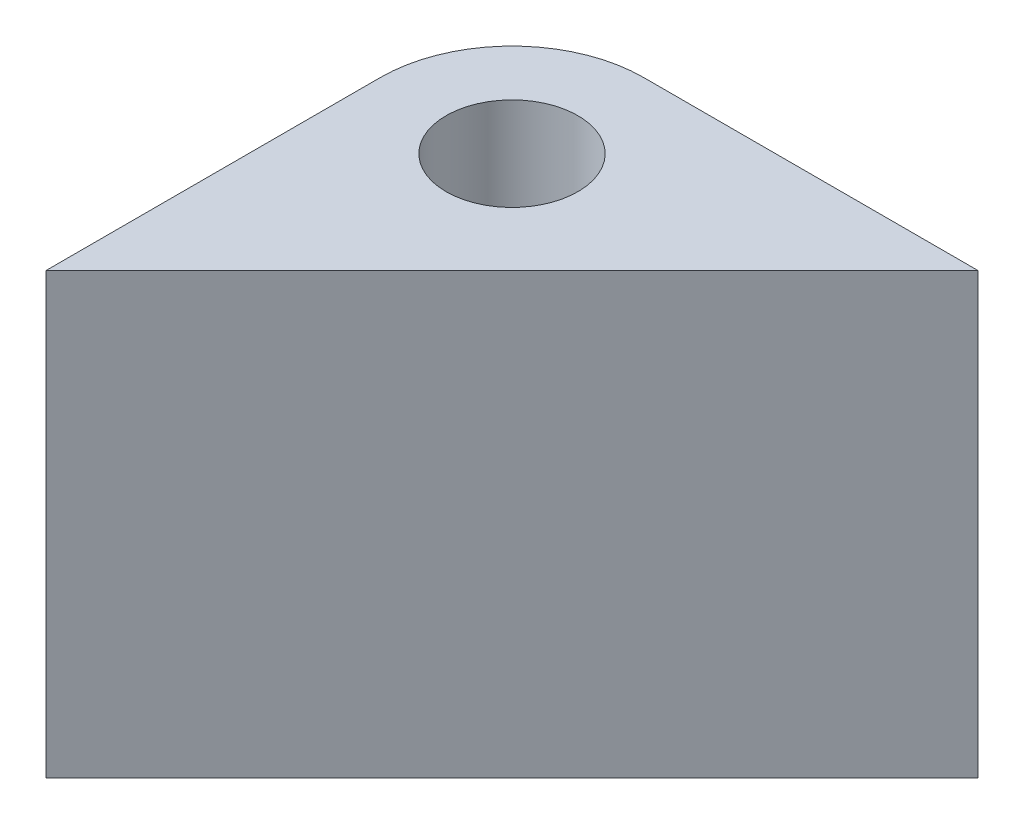
ISO-10303-21;
HEADER;
FILE_DESCRIPTION(('STEP AP214'),'2;1');
FILE_NAME('part.step','',(''),(''),'','','');
FILE_SCHEMA(('AUTOMOTIVE_DESIGN { 1 0 10303 214 1 1 1 1 }'));
ENDSEC;
DATA;
#1=APPLICATION_CONTEXT('core data for automotive mechanical design processes');
#2=APPLICATION_PROTOCOL_DEFINITION('international standard','automotive_design',2000,#1);
#3=PRODUCT_CONTEXT('',#1,'mechanical');
#4=PRODUCT('Part','Part','',(#3));
#5=PRODUCT_RELATED_PRODUCT_CATEGORY('part','',(#4));
#6=PRODUCT_DEFINITION_FORMATION('','',#4);
#7=PRODUCT_DEFINITION_CONTEXT('part definition',#1,'design');
#8=PRODUCT_DEFINITION('design','',#6,#7);
#9=PRODUCT_DEFINITION_SHAPE('','',#8);
#10=(LENGTH_UNIT() NAMED_UNIT(*) SI_UNIT(.MILLI.,.METRE.));
#11=(NAMED_UNIT(*) PLANE_ANGLE_UNIT() SI_UNIT($,.RADIAN.));
#12=(NAMED_UNIT(*) SI_UNIT($,.STERADIAN.) SOLID_ANGLE_UNIT());
#13=UNCERTAINTY_MEASURE_WITH_UNIT(LENGTH_MEASURE(1.E-05),#10,'distance_accuracy_value','');
#14=(GEOMETRIC_REPRESENTATION_CONTEXT(3) GLOBAL_UNCERTAINTY_ASSIGNED_CONTEXT((#13)) GLOBAL_UNIT_ASSIGNED_CONTEXT((#10,
#11,#12)) REPRESENTATION_CONTEXT('',''));
#15=CARTESIAN_POINT('',(0.,0.,0.));
#16=DIRECTION('',(0.,0.,1.));
#17=DIRECTION('',(1.,0.,0.));
#18=AXIS2_PLACEMENT_3D('',#15,#16,#17);
#19=CARTESIAN_POINT('',(0.,10.,0.));
#20=DIRECTION('',(0.,1.,0.));
#21=DIRECTION('',(0.,0.,1.));
#22=AXIS2_PLACEMENT_3D('',#19,#20,#21);
#23=PLANE('',#22);
#24=DIRECTION('',(0.707106781186548,0.,-0.707106781186548));
#25=VECTOR('',#24,1.);
#26=CARTESIAN_POINT('',(-3.,10.,7.60660171779821));
#27=LINE('',#26,#25);
#28=CARTESIAN_POINT('',(-3.,10.,7.60660171779821));
#29=VERTEX_POINT('',#28);
#30=CARTESIAN_POINT('',(7.60660171779821,10.,-3.));
#31=VERTEX_POINT('',#30);
#32=EDGE_CURVE('E96',#29,#31,#27,.T.);
#33=ORIENTED_EDGE('',*,*,#32,.T.);
#34=DIRECTION('',(-1.,0.,0.));
#35=VECTOR('',#34,1.);
#36=CARTESIAN_POINT('',(7.60660171779821,10.,-3.));
#37=LINE('',#36,#35);
#38=CARTESIAN_POINT('',(0.,10.,-3.));
#39=VERTEX_POINT('',#38);
#40=EDGE_CURVE('E91',#31,#39,#37,.T.);
#41=ORIENTED_EDGE('',*,*,#40,.T.);
#42=CARTESIAN_POINT('',(0.,10.,0.));
#43=DIRECTION('',(0.,1.,0.));
#44=DIRECTION('',(0.,0.,1.));
#45=AXIS2_PLACEMENT_3D('',#42,#43,#44);
#46=CIRCLE('',#45,3.);
#47=CARTESIAN_POINT('',(-3.,10.,0.));
#48=VERTEX_POINT('',#47);
#49=EDGE_CURVE('E94',#39,#48,#46,.T.);
#50=ORIENTED_EDGE('',*,*,#49,.T.);
#51=DIRECTION('',(0.,0.,1.));
#52=VECTOR('',#51,1.);
#53=CARTESIAN_POINT('',(-3.,10.,0.));
#54=LINE('',#53,#52);
#55=EDGE_CURVE('E61',#48,#29,#54,.T.);
#56=ORIENTED_EDGE('',*,*,#55,.T.);
#57=EDGE_LOOP('',(#33,#41,#50,#56));
#58=FACE_BOUND('',#57,.T.);
#59=CARTESIAN_POINT('',(0.,10.,0.));
#60=DIRECTION('',(0.,1.,0.));
#61=DIRECTION('',(0.,0.,1.));
#62=AXIS2_PLACEMENT_3D('',#59,#60,#61);
#63=CIRCLE('',#62,1.5);
#64=CARTESIAN_POINT('',(0.,10.,1.5));
#65=VERTEX_POINT('',#64);
#66=EDGE_CURVE('E118',#65,#65,#63,.T.);
#67=ORIENTED_EDGE('',*,*,#66,.F.);
#68=EDGE_LOOP('',(#67));
#69=FACE_BOUND('',#68,.T.);
#70=ADVANCED_FACE('F43',(#58,#69),#23,.T.);
#71=CARTESIAN_POINT('',(0.,0.,0.));
#72=DIRECTION('',(0.,1.,0.));
#73=DIRECTION('',(0.,0.,1.));
#74=AXIS2_PLACEMENT_3D('',#71,#72,#73);
#75=PLANE('',#74);
#76=DIRECTION('',(0.707106781186548,0.,-0.707106781186548));
#77=VECTOR('',#76,1.);
#78=CARTESIAN_POINT('',(-3.,0.,7.60660171779821));
#79=LINE('',#78,#77);
#80=CARTESIAN_POINT('',(-3.,0.,7.60660171779821));
#81=VERTEX_POINT('',#80);
#82=CARTESIAN_POINT('',(7.60660171779821,0.,-3.));
#83=VERTEX_POINT('',#82);
#84=EDGE_CURVE('E114',#81,#83,#79,.T.);
#85=ORIENTED_EDGE('',*,*,#84,.F.);
#86=DIRECTION('',(0.,0.,1.));
#87=VECTOR('',#86,1.);
#88=CARTESIAN_POINT('',(-3.,0.,0.));
#89=LINE('',#88,#87);
#90=CARTESIAN_POINT('',(-3.,0.,0.));
#91=VERTEX_POINT('',#90);
#92=EDGE_CURVE('E84',#91,#81,#89,.T.);
#93=ORIENTED_EDGE('',*,*,#92,.F.);
#94=CARTESIAN_POINT('',(0.,0.,0.));
#95=DIRECTION('',(0.,1.,0.));
#96=DIRECTION('',(0.,0.,1.));
#97=AXIS2_PLACEMENT_3D('',#94,#95,#96);
#98=CIRCLE('',#97,3.);
#99=CARTESIAN_POINT('',(0.,0.,-3.));
#100=VERTEX_POINT('',#99);
#101=EDGE_CURVE('E78',#100,#91,#98,.T.);
#102=ORIENTED_EDGE('',*,*,#101,.F.);
#103=DIRECTION('',(-1.,0.,0.));
#104=VECTOR('',#103,1.);
#105=CARTESIAN_POINT('',(7.60660171779821,0.,-3.));
#106=LINE('',#105,#104);
#107=EDGE_CURVE('E101',#83,#100,#106,.T.);
#108=ORIENTED_EDGE('',*,*,#107,.F.);
#109=EDGE_LOOP('',(#85,#93,#102,#108));
#110=FACE_BOUND('',#109,.T.);
#111=CARTESIAN_POINT('',(0.,0.,0.));
#112=DIRECTION('',(0.,1.,0.));
#113=DIRECTION('',(0.,0.,1.));
#114=AXIS2_PLACEMENT_3D('',#111,#112,#113);
#115=CIRCLE('',#114,1.5);
#116=CARTESIAN_POINT('',(0.,0.,1.5));
#117=VERTEX_POINT('',#116);
#118=EDGE_CURVE('E137',#117,#117,#115,.T.);
#119=ORIENTED_EDGE('',*,*,#118,.T.);
#120=EDGE_LOOP('',(#119));
#121=FACE_BOUND('',#120,.T.);
#122=ADVANCED_FACE('F131',(#110,#121),#75,.F.);
#123=CARTESIAN_POINT('',(-3.,10.,7.60660171779821));
#124=DIRECTION('',(-0.707106781186548,0.,-0.707106781186548));
#125=DIRECTION('',(-0.707106781186548,0.,0.707106781186548));
#126=AXIS2_PLACEMENT_3D('',#123,#124,#125);
#127=PLANE('',#126);
#128=ORIENTED_EDGE('',*,*,#84,.T.);
#129=DIRECTION('',(0.,-1.,0.));
#130=VECTOR('',#129,1.);
#131=CARTESIAN_POINT('',(7.60660171779821,10.,-3.));
#132=LINE('',#131,#130);
#133=EDGE_CURVE('E11',#31,#83,#132,.T.);
#134=ORIENTED_EDGE('',*,*,#133,.F.);
#135=ORIENTED_EDGE('',*,*,#32,.F.);
#136=DIRECTION('',(0.,-1.,0.));
#137=VECTOR('',#136,1.);
#138=CARTESIAN_POINT('',(-3.,10.,7.60660171779821));
#139=LINE('',#138,#137);
#140=EDGE_CURVE('E110',#29,#81,#139,.T.);
#141=ORIENTED_EDGE('',*,*,#140,.T.);
#142=EDGE_LOOP('',(#128,#134,#135,#141));
#143=FACE_BOUND('',#142,.T.);
#144=ADVANCED_FACE('F45',(#143),#127,.F.);
#145=CARTESIAN_POINT('',(7.60660171779821,10.,-3.));
#146=DIRECTION('',(0.,0.,1.));
#147=DIRECTION('',(1.,0.,0.));
#148=AXIS2_PLACEMENT_3D('',#145,#146,#147);
#149=PLANE('',#148);
#150=ORIENTED_EDGE('',*,*,#107,.T.);
#151=DIRECTION('',(0.,-1.,0.));
#152=VECTOR('',#151,1.);
#153=CARTESIAN_POINT('',(0.,10.,-3.));
#154=LINE('',#153,#152);
#155=EDGE_CURVE('E53',#39,#100,#154,.T.);
#156=ORIENTED_EDGE('',*,*,#155,.F.);
#157=ORIENTED_EDGE('',*,*,#40,.F.);
#158=ORIENTED_EDGE('',*,*,#133,.T.);
#159=EDGE_LOOP('',(#150,#156,#157,#158));
#160=FACE_BOUND('',#159,.T.);
#161=ADVANCED_FACE('F100',(#160),#149,.F.);
#162=CARTESIAN_POINT('',(0.,10.,0.));
#163=DIRECTION('',(0.,-1.,0.));
#164=DIRECTION('',(0.,0.,-1.));
#165=AXIS2_PLACEMENT_3D('',#162,#163,#164);
#166=CYLINDRICAL_SURFACE('',#165,3.);
#167=ORIENTED_EDGE('',*,*,#101,.T.);
#168=DIRECTION('',(0.,-1.,0.));
#169=VECTOR('',#168,1.);
#170=CARTESIAN_POINT('',(-3.,10.,0.));
#171=LINE('',#170,#169);
#172=EDGE_CURVE('E103',#48,#91,#171,.T.);
#173=ORIENTED_EDGE('',*,*,#172,.F.);
#174=ORIENTED_EDGE('',*,*,#49,.F.);
#175=ORIENTED_EDGE('',*,*,#155,.T.);
#176=EDGE_LOOP('',(#167,#173,#174,#175));
#177=FACE_BOUND('',#176,.T.);
#178=ADVANCED_FACE('F104',(#177),#166,.T.);
#179=CARTESIAN_POINT('',(-3.,10.,0.));
#180=DIRECTION('',(1.,0.,0.));
#181=DIRECTION('',(0.,0.,-1.));
#182=AXIS2_PLACEMENT_3D('',#179,#180,#181);
#183=PLANE('',#182);
#184=ORIENTED_EDGE('',*,*,#92,.T.);
#185=ORIENTED_EDGE('',*,*,#140,.F.);
#186=ORIENTED_EDGE('',*,*,#55,.F.);
#187=ORIENTED_EDGE('',*,*,#172,.T.);
#188=EDGE_LOOP('',(#184,#185,#186,#187));
#189=FACE_BOUND('',#188,.T.);
#190=ADVANCED_FACE('F128',(#189),#183,.F.);
#191=CARTESIAN_POINT('',(0.,10.,0.));
#192=DIRECTION('',(0.,-1.,0.));
#193=DIRECTION('',(0.,0.,-1.));
#194=AXIS2_PLACEMENT_3D('',#191,#192,#193);
#195=CYLINDRICAL_SURFACE('',#194,1.5);
#196=ORIENTED_EDGE('',*,*,#66,.T.);
#197=EDGE_LOOP('',(#196));
#198=FACE_BOUND('',#197,.T.);
#199=ORIENTED_EDGE('',*,*,#118,.F.);
#200=EDGE_LOOP('',(#199));
#201=FACE_BOUND('',#200,.T.);
#202=ADVANCED_FACE('F146',(#198,#201),#195,.F.);
#203=CLOSED_SHELL('',(#70,#122,#144,#161,#178,#190,#202));
#204=MANIFOLD_SOLID_BREP('B2',#203);
#205=ADVANCED_BREP_SHAPE_REPRESENTATION('',(#18,#204),#14);
#206=SHAPE_DEFINITION_REPRESENTATION(#9,#205);
ENDSEC;
END-ISO-10303-21;
